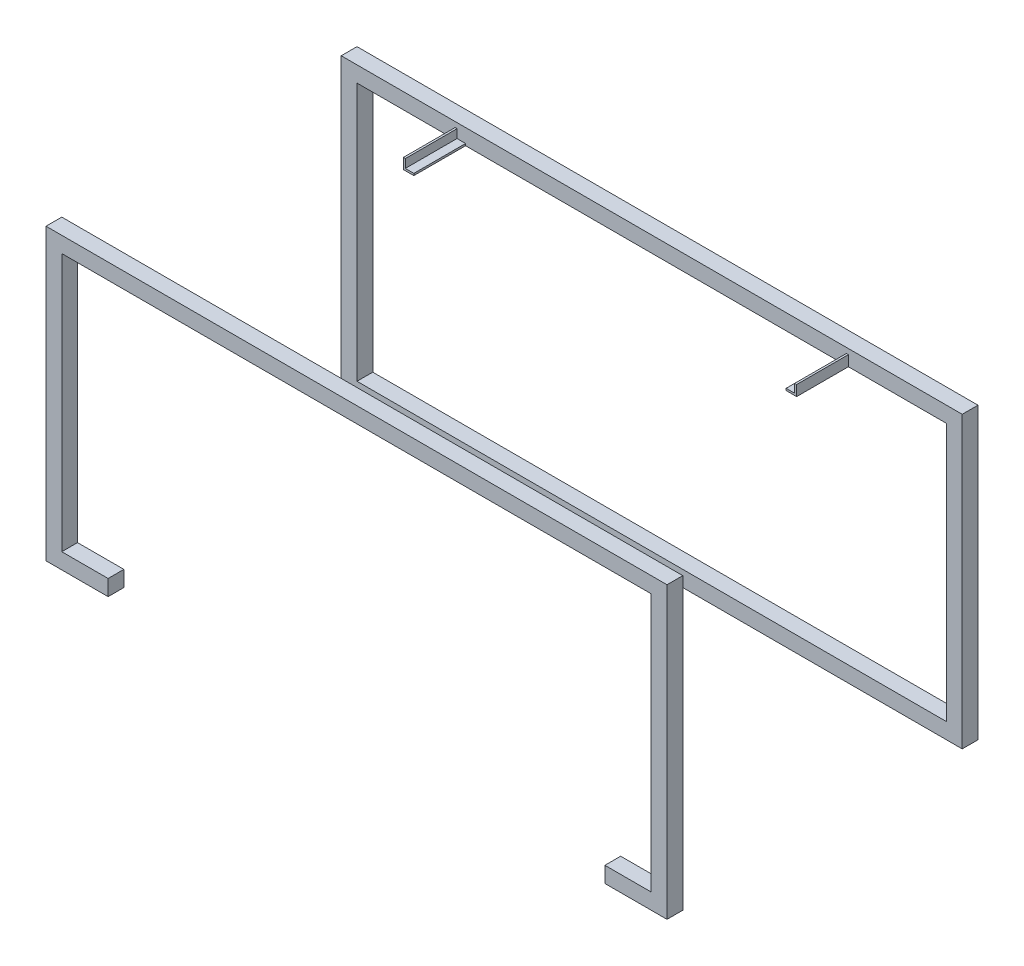
ISO-10303-21;
HEADER;
FILE_DESCRIPTION(('STEP AP214'),'2;1');
FILE_NAME('part.step','',(''),(''),'','','');
FILE_SCHEMA(('AUTOMOTIVE_DESIGN { 1 0 10303 214 1 1 1 1 }'));
ENDSEC;
DATA;
#1=APPLICATION_CONTEXT('core data for automotive mechanical design processes');
#2=APPLICATION_PROTOCOL_DEFINITION('international standard','automotive_design',2000,#1);
#3=PRODUCT_CONTEXT('',#1,'mechanical');
#4=PRODUCT('Part','Part','',(#3));
#5=PRODUCT_RELATED_PRODUCT_CATEGORY('part','',(#4));
#6=PRODUCT_DEFINITION_FORMATION('','',#4);
#7=PRODUCT_DEFINITION_CONTEXT('part definition',#1,'design');
#8=PRODUCT_DEFINITION('design','',#6,#7);
#9=PRODUCT_DEFINITION_SHAPE('','',#8);
#10=(LENGTH_UNIT() NAMED_UNIT(*) SI_UNIT(.MILLI.,.METRE.));
#11=(NAMED_UNIT(*) PLANE_ANGLE_UNIT() SI_UNIT($,.RADIAN.));
#12=(NAMED_UNIT(*) SI_UNIT($,.STERADIAN.) SOLID_ANGLE_UNIT());
#13=UNCERTAINTY_MEASURE_WITH_UNIT(LENGTH_MEASURE(1.E-05),#10,'distance_accuracy_value','');
#14=(GEOMETRIC_REPRESENTATION_CONTEXT(3) GLOBAL_UNCERTAINTY_ASSIGNED_CONTEXT((#13)) GLOBAL_UNIT_ASSIGNED_CONTEXT((#10,
#11,#12)) REPRESENTATION_CONTEXT('',''));
#15=CARTESIAN_POINT('',(0.,0.,0.));
#16=DIRECTION('',(0.,0.,1.));
#17=DIRECTION('',(1.,0.,0.));
#18=AXIS2_PLACEMENT_3D('',#15,#16,#17);
#19=CARTESIAN_POINT('',(0.,0.,76.2));
#20=DIRECTION('',(0.,1.,0.));
#21=DIRECTION('',(0.,0.,1.));
#22=AXIS2_PLACEMENT_3D('',#19,#20,#21);
#23=PLANE('',#22);
#24=DIRECTION('',(0.,0.,-1.));
#25=VECTOR('',#24,1.);
#26=CARTESIAN_POINT('',(3000.,0.,76.2));
#27=LINE('',#26,#25);
#28=CARTESIAN_POINT('',(3000.,0.,76.2));
#29=VERTEX_POINT('',#28);
#30=CARTESIAN_POINT('',(3000.,0.,0.));
#31=VERTEX_POINT('',#30);
#32=EDGE_CURVE('E213',#29,#31,#27,.T.);
#33=ORIENTED_EDGE('',*,*,#32,.F.);
#34=DIRECTION('',(-1.,0.,0.));
#35=VECTOR('',#34,1.);
#36=CARTESIAN_POINT('',(4352.14882316999,0.,76.2));
#37=LINE('',#36,#35);
#38=CARTESIAN_POINT('',(0.,0.,76.2));
#39=VERTEX_POINT('',#38);
#40=EDGE_CURVE('E210',#29,#39,#37,.T.);
#41=ORIENTED_EDGE('',*,*,#40,.T.);
#42=DIRECTION('',(0.,0.,-1.));
#43=VECTOR('',#42,1.);
#44=CARTESIAN_POINT('',(0.,0.,76.2));
#45=LINE('',#44,#43);
#46=CARTESIAN_POINT('',(0.,0.,0.));
#47=VERTEX_POINT('',#46);
#48=EDGE_CURVE('E48',#39,#47,#45,.T.);
#49=ORIENTED_EDGE('',*,*,#48,.T.);
#50=DIRECTION('',(1.,0.,0.));
#51=VECTOR('',#50,1.);
#52=CARTESIAN_POINT('',(0.,0.,0.));
#53=LINE('',#52,#51);
#54=EDGE_CURVE('E217',#47,#31,#53,.T.);
#55=ORIENTED_EDGE('',*,*,#54,.T.);
#56=EDGE_LOOP('',(#33,#41,#49,#55));
#57=FACE_BOUND('',#56,.T.);
#58=ADVANCED_FACE('F45',(#57),#23,.F.);
#59=CARTESIAN_POINT('',(3000.,1400.,76.2));
#60=DIRECTION('',(-1.,0.,0.));
#61=DIRECTION('',(0.,0.,1.));
#62=AXIS2_PLACEMENT_3D('',#59,#60,#61);
#63=PLANE('',#62);
#64=DIRECTION('',(0.,1.,0.));
#65=VECTOR('',#64,1.);
#66=CARTESIAN_POINT('',(3000.,1400.,76.2));
#67=LINE('',#66,#65);
#68=CARTESIAN_POINT('',(3000.,1400.,76.2));
#69=VERTEX_POINT('',#68);
#70=EDGE_CURVE('E229',#29,#69,#67,.T.);
#71=ORIENTED_EDGE('',*,*,#70,.F.);
#72=ORIENTED_EDGE('',*,*,#32,.T.);
#73=DIRECTION('',(0.,1.,0.));
#74=VECTOR('',#73,1.);
#75=CARTESIAN_POINT('',(3000.,1400.,0.));
#76=LINE('',#75,#74);
#77=CARTESIAN_POINT('',(3000.,1400.,0.));
#78=VERTEX_POINT('',#77);
#79=EDGE_CURVE('E216',#31,#78,#76,.T.);
#80=ORIENTED_EDGE('',*,*,#79,.T.);
#81=DIRECTION('',(0.,0.,-1.));
#82=VECTOR('',#81,1.);
#83=CARTESIAN_POINT('',(3000.,1400.,76.2));
#84=LINE('',#83,#82);
#85=EDGE_CURVE('E218',#69,#78,#84,.T.);
#86=ORIENTED_EDGE('',*,*,#85,.F.);
#87=EDGE_LOOP('',(#71,#72,#80,#86));
#88=FACE_BOUND('',#87,.T.);
#89=ADVANCED_FACE('F406',(#88),#63,.F.);
#90=CARTESIAN_POINT('',(0.,0.,76.2));
#91=DIRECTION('',(1.,0.,0.));
#92=DIRECTION('',(0.,0.,-1.));
#93=AXIS2_PLACEMENT_3D('',#90,#91,#92);
#94=PLANE('',#93);
#95=ORIENTED_EDGE('',*,*,#48,.F.);
#96=DIRECTION('',(0.,-1.,0.));
#97=VECTOR('',#96,1.);
#98=CARTESIAN_POINT('',(0.,0.,76.2));
#99=LINE('',#98,#97);
#100=CARTESIAN_POINT('',(0.,1400.,76.2000000000003));
#101=VERTEX_POINT('',#100);
#102=EDGE_CURVE('E221',#101,#39,#99,.T.);
#103=ORIENTED_EDGE('',*,*,#102,.F.);
#104=DIRECTION('',(0.,0.,-1.));
#105=VECTOR('',#104,1.);
#106=CARTESIAN_POINT('',(0.,1400.,76.2));
#107=LINE('',#106,#105);
#108=CARTESIAN_POINT('',(0.,1400.,0.));
#109=VERTEX_POINT('',#108);
#110=EDGE_CURVE('E222',#101,#109,#107,.T.);
#111=ORIENTED_EDGE('',*,*,#110,.T.);
#112=DIRECTION('',(0.,-1.,0.));
#113=VECTOR('',#112,1.);
#114=CARTESIAN_POINT('',(0.,0.,0.));
#115=LINE('',#114,#113);
#116=EDGE_CURVE('E224',#109,#47,#115,.T.);
#117=ORIENTED_EDGE('',*,*,#116,.T.);
#118=EDGE_LOOP('',(#95,#103,#111,#117));
#119=FACE_BOUND('',#118,.T.);
#120=ADVANCED_FACE('F411',(#119),#94,.F.);
#121=CARTESIAN_POINT('',(0.,0.,76.2));
#122=DIRECTION('',(0.,0.,-1.));
#123=DIRECTION('',(-1.,0.,0.));
#124=AXIS2_PLACEMENT_3D('',#121,#122,#123);
#125=PLANE('',#124);
#126=DIRECTION('',(0.,1.,0.));
#127=VECTOR('',#126,1.);
#128=CARTESIAN_POINT('',(2923.8,1323.8,76.2));
#129=LINE('',#128,#127);
#130=CARTESIAN_POINT('',(2923.8,76.2,76.2));
#131=VERTEX_POINT('',#130);
#132=CARTESIAN_POINT('',(2923.8,1323.8,76.2));
#133=VERTEX_POINT('',#132);
#134=EDGE_CURVE('E254',#131,#133,#129,.T.);
#135=ORIENTED_EDGE('',*,*,#134,.F.);
#136=DIRECTION('',(1.,0.,0.));
#137=VECTOR('',#136,1.);
#138=CARTESIAN_POINT('',(76.2,76.2,76.2));
#139=LINE('',#138,#137);
#140=CARTESIAN_POINT('',(76.2,76.2,76.2));
#141=VERTEX_POINT('',#140);
#142=EDGE_CURVE('E63',#141,#131,#139,.T.);
#143=ORIENTED_EDGE('',*,*,#142,.F.);
#144=DIRECTION('',(0.,-1.,0.));
#145=VECTOR('',#144,1.);
#146=CARTESIAN_POINT('',(76.2,76.2,76.2));
#147=LINE('',#146,#145);
#148=CARTESIAN_POINT('',(76.2,1323.8,76.2));
#149=VERTEX_POINT('',#148);
#150=EDGE_CURVE('E251',#149,#141,#147,.T.);
#151=ORIENTED_EDGE('',*,*,#150,.F.);
#152=DIRECTION('',(-1.,0.,0.));
#153=VECTOR('',#152,1.);
#154=CARTESIAN_POINT('',(76.2,1323.8,76.2));
#155=LINE('',#154,#153);
#156=CARTESIAN_POINT('',(550.,1323.8,76.2));
#157=VERTEX_POINT('',#156);
#158=EDGE_CURVE('E262',#157,#149,#155,.T.);
#159=ORIENTED_EDGE('',*,*,#158,.F.);
#160=DIRECTION('',(0.,-1.,0.));
#161=VECTOR('',#160,1.);
#162=CARTESIAN_POINT('',(550.,1323.8,76.2));
#163=LINE('',#162,#161);
#164=CARTESIAN_POINT('',(550.,1374.6,76.2));
#165=VERTEX_POINT('',#164);
#166=EDGE_CURVE('E296',#165,#157,#163,.T.);
#167=ORIENTED_EDGE('',*,*,#166,.F.);
#168=DIRECTION('',(-1.,0.,0.));
#169=VECTOR('',#168,1.);
#170=CARTESIAN_POINT('',(559.525,1374.6,76.2));
#171=LINE('',#170,#169);
#172=CARTESIAN_POINT('',(559.525,1374.6,76.2));
#173=VERTEX_POINT('',#172);
#174=EDGE_CURVE('E292',#173,#165,#171,.T.);
#175=ORIENTED_EDGE('',*,*,#174,.F.);
#176=DIRECTION('',(0.,1.,0.));
#177=VECTOR('',#176,1.);
#178=CARTESIAN_POINT('',(559.525,1333.325,76.2));
#179=LINE('',#178,#177);
#180=CARTESIAN_POINT('',(559.525,1333.325,76.2));
#181=VERTEX_POINT('',#180);
#182=EDGE_CURVE('E288',#181,#173,#179,.T.);
#183=ORIENTED_EDGE('',*,*,#182,.F.);
#184=DIRECTION('',(-1.,0.,0.));
#185=VECTOR('',#184,1.);
#186=CARTESIAN_POINT('',(559.525,1333.325,76.2));
#187=LINE('',#186,#185);
#188=CARTESIAN_POINT('',(600.8,1333.325,76.2));
#189=VERTEX_POINT('',#188);
#190=EDGE_CURVE('E284',#189,#181,#187,.T.);
#191=ORIENTED_EDGE('',*,*,#190,.F.);
#192=DIRECTION('',(0.,1.,0.));
#193=VECTOR('',#192,1.);
#194=CARTESIAN_POINT('',(600.8,1333.325,76.2));
#195=LINE('',#194,#193);
#196=CARTESIAN_POINT('',(600.8,1323.8,76.2));
#197=VERTEX_POINT('',#196);
#198=EDGE_CURVE('E261',#197,#189,#195,.T.);
#199=ORIENTED_EDGE('',*,*,#198,.F.);
#200=CARTESIAN_POINT('',(2399.2,1323.8,76.2));
#201=VERTEX_POINT('',#200);
#202=EDGE_CURVE('E198',#201,#197,#155,.T.);
#203=ORIENTED_EDGE('',*,*,#202,.F.);
#204=DIRECTION('',(0.,-1.,0.));
#205=VECTOR('',#204,1.);
#206=CARTESIAN_POINT('',(2399.2,1333.325,76.2));
#207=LINE('',#206,#205);
#208=CARTESIAN_POINT('',(2399.2,1333.325,76.2));
#209=VERTEX_POINT('',#208);
#210=EDGE_CURVE('E192',#209,#201,#207,.T.);
#211=ORIENTED_EDGE('',*,*,#210,.F.);
#212=DIRECTION('',(-1.,0.,0.));
#213=VECTOR('',#212,1.);
#214=CARTESIAN_POINT('',(2440.475,1333.325,76.2));
#215=LINE('',#214,#213);
#216=CARTESIAN_POINT('',(2440.475,1333.325,76.2));
#217=VERTEX_POINT('',#216);
#218=EDGE_CURVE('E188',#217,#209,#215,.T.);
#219=ORIENTED_EDGE('',*,*,#218,.F.);
#220=DIRECTION('',(0.,-1.,0.));
#221=VECTOR('',#220,1.);
#222=CARTESIAN_POINT('',(2440.475,1333.325,76.2));
#223=LINE('',#222,#221);
#224=CARTESIAN_POINT('',(2440.475,1374.6,76.2));
#225=VERTEX_POINT('',#224);
#226=EDGE_CURVE('E177',#225,#217,#223,.T.);
#227=ORIENTED_EDGE('',*,*,#226,.F.);
#228=DIRECTION('',(-1.,0.,0.));
#229=VECTOR('',#228,1.);
#230=CARTESIAN_POINT('',(2440.475,1374.6,76.2));
#231=LINE('',#230,#229);
#232=CARTESIAN_POINT('',(2450.,1374.6,76.2));
#233=VERTEX_POINT('',#232);
#234=EDGE_CURVE('E178',#233,#225,#231,.T.);
#235=ORIENTED_EDGE('',*,*,#234,.F.);
#236=DIRECTION('',(0.,1.,0.));
#237=VECTOR('',#236,1.);
#238=CARTESIAN_POINT('',(2450.,1323.8,76.2));
#239=LINE('',#238,#237);
#240=CARTESIAN_POINT('',(2450.,1323.8,76.2));
#241=VERTEX_POINT('',#240);
#242=EDGE_CURVE('E175',#241,#233,#239,.T.);
#243=ORIENTED_EDGE('',*,*,#242,.F.);
#244=EDGE_CURVE('E199',#133,#241,#155,.T.);
#245=ORIENTED_EDGE('',*,*,#244,.F.);
#246=EDGE_LOOP('',(#135,#143,#151,#159,#167,#175,#183,#191,#199,#203,#211,#219,#227,#235,#243,#245));
#247=FACE_BOUND('',#246,.T.);
#248=ORIENTED_EDGE('',*,*,#40,.F.);
#249=ORIENTED_EDGE('',*,*,#70,.T.);
#250=DIRECTION('',(-1.,0.,0.));
#251=VECTOR('',#250,1.);
#252=CARTESIAN_POINT('',(0.,1400.,76.2));
#253=LINE('',#252,#251);
#254=EDGE_CURVE('E243',#69,#101,#253,.T.);
#255=ORIENTED_EDGE('',*,*,#254,.T.);
#256=ORIENTED_EDGE('',*,*,#102,.T.);
#257=EDGE_LOOP('',(#248,#249,#255,#256));
#258=FACE_BOUND('',#257,.T.);
#259=ADVANCED_FACE('F334',(#247,#258),#125,.F.);
#260=CARTESIAN_POINT('',(0.,1400.,76.2));
#261=DIRECTION('',(0.,-1.,0.));
#262=DIRECTION('',(0.,0.,-1.));
#263=AXIS2_PLACEMENT_3D('',#260,#261,#262);
#264=PLANE('',#263);
#265=ORIENTED_EDGE('',*,*,#110,.F.);
#266=ORIENTED_EDGE('',*,*,#254,.F.);
#267=ORIENTED_EDGE('',*,*,#85,.T.);
#268=DIRECTION('',(-1.,0.,0.));
#269=VECTOR('',#268,1.);
#270=CARTESIAN_POINT('',(0.,1400.,0.));
#271=LINE('',#270,#269);
#272=EDGE_CURVE('E220',#78,#109,#271,.T.);
#273=ORIENTED_EDGE('',*,*,#272,.T.);
#274=EDGE_LOOP('',(#265,#266,#267,#273));
#275=FACE_BOUND('',#274,.T.);
#276=ADVANCED_FACE('F418',(#275),#264,.F.);
#277=CARTESIAN_POINT('',(0.,0.,0.));
#278=DIRECTION('',(0.,0.,-1.));
#279=DIRECTION('',(-1.,0.,0.));
#280=AXIS2_PLACEMENT_3D('',#277,#278,#279);
#281=PLANE('',#280);
#282=ORIENTED_EDGE('',*,*,#54,.F.);
#283=ORIENTED_EDGE('',*,*,#116,.F.);
#284=ORIENTED_EDGE('',*,*,#272,.F.);
#285=ORIENTED_EDGE('',*,*,#79,.F.);
#286=EDGE_LOOP('',(#282,#283,#284,#285));
#287=FACE_BOUND('',#286,.T.);
#288=DIRECTION('',(-1.,0.,0.));
#289=VECTOR('',#288,1.);
#290=CARTESIAN_POINT('',(76.2,1323.8,0.));
#291=LINE('',#290,#289);
#292=CARTESIAN_POINT('',(2923.8,1323.8,0.));
#293=VERTEX_POINT('',#292);
#294=CARTESIAN_POINT('',(76.2,1323.8,0.));
#295=VERTEX_POINT('',#294);
#296=EDGE_CURVE('E263',#293,#295,#291,.T.);
#297=ORIENTED_EDGE('',*,*,#296,.T.);
#298=DIRECTION('',(0.,-1.,0.));
#299=VECTOR('',#298,1.);
#300=CARTESIAN_POINT('',(76.2,76.2,0.));
#301=LINE('',#300,#299);
#302=CARTESIAN_POINT('',(76.2,76.2,0.));
#303=VERTEX_POINT('',#302);
#304=EDGE_CURVE('E266',#295,#303,#301,.T.);
#305=ORIENTED_EDGE('',*,*,#304,.T.);
#306=DIRECTION('',(1.,0.,0.));
#307=VECTOR('',#306,1.);
#308=CARTESIAN_POINT('',(76.2,76.2,0.));
#309=LINE('',#308,#307);
#310=CARTESIAN_POINT('',(2923.8,76.2,0.));
#311=VERTEX_POINT('',#310);
#312=EDGE_CURVE('E270',#303,#311,#309,.T.);
#313=ORIENTED_EDGE('',*,*,#312,.T.);
#314=DIRECTION('',(0.,1.,0.));
#315=VECTOR('',#314,1.);
#316=CARTESIAN_POINT('',(2923.8,1323.8,0.));
#317=LINE('',#316,#315);
#318=EDGE_CURVE('E267',#311,#293,#317,.T.);
#319=ORIENTED_EDGE('',*,*,#318,.T.);
#320=EDGE_LOOP('',(#297,#305,#313,#319));
#321=FACE_BOUND('',#320,.T.);
#322=ADVANCED_FACE('F380',(#287,#321),#281,.T.);
#323=CARTESIAN_POINT('',(76.2,76.2,76.2));
#324=DIRECTION('',(1.,0.,0.));
#325=DIRECTION('',(0.,0.,-1.));
#326=AXIS2_PLACEMENT_3D('',#323,#324,#325);
#327=PLANE('',#326);
#328=ORIENTED_EDGE('',*,*,#304,.F.);
#329=DIRECTION('',(0.,0.,-1.));
#330=VECTOR('',#329,1.);
#331=CARTESIAN_POINT('',(76.2,1323.8,76.2));
#332=LINE('',#331,#330);
#333=EDGE_CURVE('E258',#149,#295,#332,.T.);
#334=ORIENTED_EDGE('',*,*,#333,.F.);
#335=ORIENTED_EDGE('',*,*,#150,.T.);
#336=DIRECTION('',(0.,0.,-1.));
#337=VECTOR('',#336,1.);
#338=CARTESIAN_POINT('',(76.2,76.2,76.2));
#339=LINE('',#338,#337);
#340=EDGE_CURVE('E248',#141,#303,#339,.T.);
#341=ORIENTED_EDGE('',*,*,#340,.T.);
#342=EDGE_LOOP('',(#328,#334,#335,#341));
#343=FACE_BOUND('',#342,.T.);
#344=ADVANCED_FACE('F378',(#343),#327,.T.);
#345=CARTESIAN_POINT('',(76.2,76.2,76.2));
#346=DIRECTION('',(0.,1.,0.));
#347=DIRECTION('',(0.,0.,1.));
#348=AXIS2_PLACEMENT_3D('',#345,#346,#347);
#349=PLANE('',#348);
#350=ORIENTED_EDGE('',*,*,#312,.F.);
#351=ORIENTED_EDGE('',*,*,#340,.F.);
#352=ORIENTED_EDGE('',*,*,#142,.T.);
#353=DIRECTION('',(0.,0.,-1.));
#354=VECTOR('',#353,1.);
#355=CARTESIAN_POINT('',(2923.8,76.2,76.2));
#356=LINE('',#355,#354);
#357=EDGE_CURVE('E252',#131,#311,#356,.T.);
#358=ORIENTED_EDGE('',*,*,#357,.T.);
#359=EDGE_LOOP('',(#350,#351,#352,#358));
#360=FACE_BOUND('',#359,.T.);
#361=ADVANCED_FACE('F375',(#360),#349,.T.);
#362=CARTESIAN_POINT('',(2923.8,1323.8,76.2));
#363=DIRECTION('',(-1.,0.,0.));
#364=DIRECTION('',(0.,0.,1.));
#365=AXIS2_PLACEMENT_3D('',#362,#363,#364);
#366=PLANE('',#365);
#367=ORIENTED_EDGE('',*,*,#318,.F.);
#368=ORIENTED_EDGE('',*,*,#357,.F.);
#369=ORIENTED_EDGE('',*,*,#134,.T.);
#370=DIRECTION('',(0.,0.,-1.));
#371=VECTOR('',#370,1.);
#372=CARTESIAN_POINT('',(2923.8,1323.8,76.2));
#373=LINE('',#372,#371);
#374=EDGE_CURVE('E255',#133,#293,#373,.T.);
#375=ORIENTED_EDGE('',*,*,#374,.T.);
#376=EDGE_LOOP('',(#367,#368,#369,#375));
#377=FACE_BOUND('',#376,.T.);
#378=ADVANCED_FACE('F383',(#377),#366,.T.);
#379=CARTESIAN_POINT('',(76.2,1323.8,76.2));
#380=DIRECTION('',(0.,-1.,0.));
#381=DIRECTION('',(0.,0.,-1.));
#382=AXIS2_PLACEMENT_3D('',#379,#380,#381);
#383=PLANE('',#382);
#384=ORIENTED_EDGE('',*,*,#296,.F.);
#385=ORIENTED_EDGE('',*,*,#374,.F.);
#386=ORIENTED_EDGE('',*,*,#244,.T.);
#387=DIRECTION('',(0.,0.,-1.));
#388=VECTOR('',#387,1.);
#389=CARTESIAN_POINT('',(2450.,1323.8,326.2));
#390=LINE('',#389,#388);
#391=CARTESIAN_POINT('',(2450.,1323.8,326.2));
#392=VERTEX_POINT('',#391);
#393=EDGE_CURVE('E181',#392,#241,#390,.T.);
#394=ORIENTED_EDGE('',*,*,#393,.F.);
#395=DIRECTION('',(1.,0.,0.));
#396=VECTOR('',#395,1.);
#397=CARTESIAN_POINT('',(2450.,1323.8,326.2));
#398=LINE('',#397,#396);
#399=CARTESIAN_POINT('',(2399.2,1323.8,326.2));
#400=VERTEX_POINT('',#399);
#401=EDGE_CURVE('E12',#400,#392,#398,.T.);
#402=ORIENTED_EDGE('',*,*,#401,.F.);
#403=DIRECTION('',(0.,0.,-1.));
#404=VECTOR('',#403,1.);
#405=CARTESIAN_POINT('',(2399.2,1323.8,326.2));
#406=LINE('',#405,#404);
#407=EDGE_CURVE('E195',#400,#201,#406,.T.);
#408=ORIENTED_EDGE('',*,*,#407,.T.);
#409=ORIENTED_EDGE('',*,*,#202,.T.);
#410=DIRECTION('',(0.,0.,-1.));
#411=VECTOR('',#410,1.);
#412=CARTESIAN_POINT('',(600.8,1323.8,326.2));
#413=LINE('',#412,#411);
#414=CARTESIAN_POINT('',(600.8,1323.8,326.2));
#415=VERTEX_POINT('',#414);
#416=EDGE_CURVE('E281',#415,#197,#413,.T.);
#417=ORIENTED_EDGE('',*,*,#416,.F.);
#418=DIRECTION('',(1.,0.,0.));
#419=VECTOR('',#418,1.);
#420=CARTESIAN_POINT('',(550.,1323.8,326.2));
#421=LINE('',#420,#419);
#422=CARTESIAN_POINT('',(550.,1323.8,326.2));
#423=VERTEX_POINT('',#422);
#424=EDGE_CURVE('E185',#423,#415,#421,.T.);
#425=ORIENTED_EDGE('',*,*,#424,.F.);
#426=DIRECTION('',(0.,0.,-1.));
#427=VECTOR('',#426,1.);
#428=CARTESIAN_POINT('',(550.,1323.8,326.2));
#429=LINE('',#428,#427);
#430=EDGE_CURVE('E300',#423,#157,#429,.T.);
#431=ORIENTED_EDGE('',*,*,#430,.T.);
#432=ORIENTED_EDGE('',*,*,#158,.T.);
#433=ORIENTED_EDGE('',*,*,#333,.T.);
#434=EDGE_LOOP('',(#384,#385,#386,#394,#402,#408,#409,#417,#425,#431,#432,#433));
#435=FACE_BOUND('',#434,.T.);
#436=ADVANCED_FACE('F326',(#435),#383,.T.);
#437=CARTESIAN_POINT('',(600.8,1333.325,326.2));
#438=DIRECTION('',(-1.,0.,0.));
#439=DIRECTION('',(0.,0.,1.));
#440=AXIS2_PLACEMENT_3D('',#437,#438,#439);
#441=PLANE('',#440);
#442=ORIENTED_EDGE('',*,*,#198,.T.);
#443=DIRECTION('',(0.,0.,-1.));
#444=VECTOR('',#443,1.);
#445=CARTESIAN_POINT('',(600.8,1333.325,326.2));
#446=LINE('',#445,#444);
#447=CARTESIAN_POINT('',(600.8,1333.325,326.2));
#448=VERTEX_POINT('',#447);
#449=EDGE_CURVE('E285',#448,#189,#446,.T.);
#450=ORIENTED_EDGE('',*,*,#449,.F.);
#451=DIRECTION('',(0.,1.,0.));
#452=VECTOR('',#451,1.);
#453=CARTESIAN_POINT('',(600.8,1333.325,326.2));
#454=LINE('',#453,#452);
#455=EDGE_CURVE('E315',#415,#448,#454,.T.);
#456=ORIENTED_EDGE('',*,*,#455,.F.);
#457=ORIENTED_EDGE('',*,*,#416,.T.);
#458=EDGE_LOOP('',(#442,#450,#456,#457));
#459=FACE_BOUND('',#458,.T.);
#460=ADVANCED_FACE('F330',(#459),#441,.F.);
#461=CARTESIAN_POINT('',(559.525,1333.325,326.2));
#462=DIRECTION('',(0.,-1.,0.));
#463=DIRECTION('',(0.,0.,-1.));
#464=AXIS2_PLACEMENT_3D('',#461,#462,#463);
#465=PLANE('',#464);
#466=ORIENTED_EDGE('',*,*,#190,.T.);
#467=DIRECTION('',(0.,0.,-1.));
#468=VECTOR('',#467,1.);
#469=CARTESIAN_POINT('',(559.525,1333.325,326.2));
#470=LINE('',#469,#468);
#471=CARTESIAN_POINT('',(559.525,1333.325,326.2));
#472=VERTEX_POINT('',#471);
#473=EDGE_CURVE('E289',#472,#181,#470,.T.);
#474=ORIENTED_EDGE('',*,*,#473,.F.);
#475=DIRECTION('',(-1.,0.,0.));
#476=VECTOR('',#475,1.);
#477=CARTESIAN_POINT('',(559.525,1333.325,326.2));
#478=LINE('',#477,#476);
#479=EDGE_CURVE('E314',#448,#472,#478,.T.);
#480=ORIENTED_EDGE('',*,*,#479,.F.);
#481=ORIENTED_EDGE('',*,*,#449,.T.);
#482=EDGE_LOOP('',(#466,#474,#480,#481));
#483=FACE_BOUND('',#482,.T.);
#484=ADVANCED_FACE('F341',(#483),#465,.F.);
#485=CARTESIAN_POINT('',(559.525,1333.325,326.2));
#486=DIRECTION('',(-1.,0.,0.));
#487=DIRECTION('',(0.,0.,1.));
#488=AXIS2_PLACEMENT_3D('',#485,#486,#487);
#489=PLANE('',#488);
#490=ORIENTED_EDGE('',*,*,#182,.T.);
#491=DIRECTION('',(0.,0.,-1.));
#492=VECTOR('',#491,1.);
#493=CARTESIAN_POINT('',(559.525,1374.6,326.2));
#494=LINE('',#493,#492);
#495=CARTESIAN_POINT('',(559.525,1374.6,326.2));
#496=VERTEX_POINT('',#495);
#497=EDGE_CURVE('E293',#496,#173,#494,.T.);
#498=ORIENTED_EDGE('',*,*,#497,.F.);
#499=DIRECTION('',(0.,1.,0.));
#500=VECTOR('',#499,1.);
#501=CARTESIAN_POINT('',(559.525,1333.325,326.2));
#502=LINE('',#501,#500);
#503=EDGE_CURVE('E312',#472,#496,#502,.T.);
#504=ORIENTED_EDGE('',*,*,#503,.F.);
#505=ORIENTED_EDGE('',*,*,#473,.T.);
#506=EDGE_LOOP('',(#490,#498,#504,#505));
#507=FACE_BOUND('',#506,.T.);
#508=ADVANCED_FACE('F345',(#507),#489,.F.);
#509=CARTESIAN_POINT('',(559.525,1374.6,326.2));
#510=DIRECTION('',(0.,-1.,0.));
#511=DIRECTION('',(0.,0.,-1.));
#512=AXIS2_PLACEMENT_3D('',#509,#510,#511);
#513=PLANE('',#512);
#514=ORIENTED_EDGE('',*,*,#174,.T.);
#515=DIRECTION('',(0.,0.,-1.));
#516=VECTOR('',#515,1.);
#517=CARTESIAN_POINT('',(550.,1374.6,326.2));
#518=LINE('',#517,#516);
#519=CARTESIAN_POINT('',(550.,1374.6,326.2));
#520=VERTEX_POINT('',#519);
#521=EDGE_CURVE('E297',#520,#165,#518,.T.);
#522=ORIENTED_EDGE('',*,*,#521,.F.);
#523=DIRECTION('',(-1.,0.,0.));
#524=VECTOR('',#523,1.);
#525=CARTESIAN_POINT('',(559.525,1374.6,326.2));
#526=LINE('',#525,#524);
#527=EDGE_CURVE('E310',#496,#520,#526,.T.);
#528=ORIENTED_EDGE('',*,*,#527,.F.);
#529=ORIENTED_EDGE('',*,*,#497,.T.);
#530=EDGE_LOOP('',(#514,#522,#528,#529));
#531=FACE_BOUND('',#530,.T.);
#532=ADVANCED_FACE('F350',(#531),#513,.F.);
#533=CARTESIAN_POINT('',(550.,1323.8,326.2));
#534=DIRECTION('',(1.,0.,0.));
#535=DIRECTION('',(0.,0.,-1.));
#536=AXIS2_PLACEMENT_3D('',#533,#534,#535);
#537=PLANE('',#536);
#538=ORIENTED_EDGE('',*,*,#166,.T.);
#539=ORIENTED_EDGE('',*,*,#430,.F.);
#540=DIRECTION('',(0.,-1.,0.));
#541=VECTOR('',#540,1.);
#542=CARTESIAN_POINT('',(550.,1323.8,326.2));
#543=LINE('',#542,#541);
#544=EDGE_CURVE('E204',#520,#423,#543,.T.);
#545=ORIENTED_EDGE('',*,*,#544,.F.);
#546=ORIENTED_EDGE('',*,*,#521,.T.);
#547=EDGE_LOOP('',(#538,#539,#545,#546));
#548=FACE_BOUND('',#547,.T.);
#549=ADVANCED_FACE('F353',(#548),#537,.F.);
#550=CARTESIAN_POINT('',(0.,0.,326.2));
#551=DIRECTION('',(0.,0.,-1.));
#552=DIRECTION('',(-1.,0.,0.));
#553=AXIS2_PLACEMENT_3D('',#550,#551,#552);
#554=PLANE('',#553);
#555=ORIENTED_EDGE('',*,*,#424,.T.);
#556=ORIENTED_EDGE('',*,*,#455,.T.);
#557=ORIENTED_EDGE('',*,*,#479,.T.);
#558=ORIENTED_EDGE('',*,*,#503,.T.);
#559=ORIENTED_EDGE('',*,*,#527,.T.);
#560=ORIENTED_EDGE('',*,*,#544,.T.);
#561=EDGE_LOOP('',(#555,#556,#557,#558,#559,#560));
#562=FACE_BOUND('',#561,.T.);
#563=ADVANCED_FACE('F321',(#562),#554,.F.);
#564=CARTESIAN_POINT('',(2450.,1323.8,326.2));
#565=DIRECTION('',(-1.,0.,0.));
#566=DIRECTION('',(0.,0.,1.));
#567=AXIS2_PLACEMENT_3D('',#564,#565,#566);
#568=PLANE('',#567);
#569=ORIENTED_EDGE('',*,*,#242,.T.);
#570=DIRECTION('',(0.,0.,-1.));
#571=VECTOR('',#570,1.);
#572=CARTESIAN_POINT('',(2450.,1374.6,326.2));
#573=LINE('',#572,#571);
#574=CARTESIAN_POINT('',(2450.,1374.6,326.2));
#575=VERTEX_POINT('',#574);
#576=EDGE_CURVE('E157',#575,#233,#573,.T.);
#577=ORIENTED_EDGE('',*,*,#576,.F.);
#578=DIRECTION('',(0.,1.,0.));
#579=VECTOR('',#578,1.);
#580=CARTESIAN_POINT('',(2450.,1323.8,326.2));
#581=LINE('',#580,#579);
#582=EDGE_CURVE('E164',#392,#575,#581,.T.);
#583=ORIENTED_EDGE('',*,*,#582,.F.);
#584=ORIENTED_EDGE('',*,*,#393,.T.);
#585=EDGE_LOOP('',(#569,#577,#583,#584));
#586=FACE_BOUND('',#585,.T.);
#587=ADVANCED_FACE('F173',(#586),#568,.F.);
#588=CARTESIAN_POINT('',(2440.475,1374.6,326.2));
#589=DIRECTION('',(0.,-1.,0.));
#590=DIRECTION('',(0.,0.,-1.));
#591=AXIS2_PLACEMENT_3D('',#588,#589,#590);
#592=PLANE('',#591);
#593=ORIENTED_EDGE('',*,*,#234,.T.);
#594=DIRECTION('',(0.,0.,-1.));
#595=VECTOR('',#594,1.);
#596=CARTESIAN_POINT('',(2440.475,1374.6,326.2));
#597=LINE('',#596,#595);
#598=CARTESIAN_POINT('',(2440.475,1374.6,326.2));
#599=VERTEX_POINT('',#598);
#600=EDGE_CURVE('E160',#599,#225,#597,.T.);
#601=ORIENTED_EDGE('',*,*,#600,.F.);
#602=DIRECTION('',(-1.,0.,0.));
#603=VECTOR('',#602,1.);
#604=CARTESIAN_POINT('',(2440.475,1374.6,326.2));
#605=LINE('',#604,#603);
#606=EDGE_CURVE('E153',#575,#599,#605,.T.);
#607=ORIENTED_EDGE('',*,*,#606,.F.);
#608=ORIENTED_EDGE('',*,*,#576,.T.);
#609=EDGE_LOOP('',(#593,#601,#607,#608));
#610=FACE_BOUND('',#609,.T.);
#611=ADVANCED_FACE('F155',(#610),#592,.F.);
#612=CARTESIAN_POINT('',(2440.475,1333.325,326.2));
#613=DIRECTION('',(1.,0.,0.));
#614=DIRECTION('',(0.,0.,-1.));
#615=AXIS2_PLACEMENT_3D('',#612,#613,#614);
#616=PLANE('',#615);
#617=ORIENTED_EDGE('',*,*,#226,.T.);
#618=DIRECTION('',(0.,0.,-1.));
#619=VECTOR('',#618,1.);
#620=CARTESIAN_POINT('',(2440.475,1333.325,326.2));
#621=LINE('',#620,#619);
#622=CARTESIAN_POINT('',(2440.475,1333.325,326.2));
#623=VERTEX_POINT('',#622);
#624=EDGE_CURVE('E189',#623,#217,#621,.T.);
#625=ORIENTED_EDGE('',*,*,#624,.F.);
#626=DIRECTION('',(0.,-1.,0.));
#627=VECTOR('',#626,1.);
#628=CARTESIAN_POINT('',(2440.475,1333.325,326.2));
#629=LINE('',#628,#627);
#630=EDGE_CURVE('E163',#599,#623,#629,.T.);
#631=ORIENTED_EDGE('',*,*,#630,.F.);
#632=ORIENTED_EDGE('',*,*,#600,.T.);
#633=EDGE_LOOP('',(#617,#625,#631,#632));
#634=FACE_BOUND('',#633,.T.);
#635=ADVANCED_FACE('F387',(#634),#616,.F.);
#636=CARTESIAN_POINT('',(2440.475,1333.325,326.2));
#637=DIRECTION('',(0.,-1.,0.));
#638=DIRECTION('',(0.,0.,-1.));
#639=AXIS2_PLACEMENT_3D('',#636,#637,#638);
#640=PLANE('',#639);
#641=ORIENTED_EDGE('',*,*,#218,.T.);
#642=DIRECTION('',(0.,0.,-1.));
#643=VECTOR('',#642,1.);
#644=CARTESIAN_POINT('',(2399.2,1333.325,326.2));
#645=LINE('',#644,#643);
#646=CARTESIAN_POINT('',(2399.2,1333.325,326.2));
#647=VERTEX_POINT('',#646);
#648=EDGE_CURVE('E171',#647,#209,#645,.T.);
#649=ORIENTED_EDGE('',*,*,#648,.F.);
#650=DIRECTION('',(-1.,0.,0.));
#651=VECTOR('',#650,1.);
#652=CARTESIAN_POINT('',(2440.475,1333.325,326.2));
#653=LINE('',#652,#651);
#654=EDGE_CURVE('E207',#623,#647,#653,.T.);
#655=ORIENTED_EDGE('',*,*,#654,.F.);
#656=ORIENTED_EDGE('',*,*,#624,.T.);
#657=EDGE_LOOP('',(#641,#649,#655,#656));
#658=FACE_BOUND('',#657,.T.);
#659=ADVANCED_FACE('F394',(#658),#640,.F.);
#660=CARTESIAN_POINT('',(2399.2,1333.325,326.2));
#661=DIRECTION('',(1.,0.,0.));
#662=DIRECTION('',(0.,0.,-1.));
#663=AXIS2_PLACEMENT_3D('',#660,#661,#662);
#664=PLANE('',#663);
#665=ORIENTED_EDGE('',*,*,#210,.T.);
#666=ORIENTED_EDGE('',*,*,#407,.F.);
#667=DIRECTION('',(0.,-1.,0.));
#668=VECTOR('',#667,1.);
#669=CARTESIAN_POINT('',(2399.2,1333.325,326.2));
#670=LINE('',#669,#668);
#671=EDGE_CURVE('E54',#647,#400,#670,.T.);
#672=ORIENTED_EDGE('',*,*,#671,.F.);
#673=ORIENTED_EDGE('',*,*,#648,.T.);
#674=EDGE_LOOP('',(#665,#666,#672,#673));
#675=FACE_BOUND('',#674,.T.);
#676=ADVANCED_FACE('F396',(#675),#664,.F.);
#677=CARTESIAN_POINT('',(0.,0.,326.2));
#678=DIRECTION('',(0.,0.,-1.));
#679=DIRECTION('',(-1.,0.,0.));
#680=AXIS2_PLACEMENT_3D('',#677,#678,#679);
#681=PLANE('',#680);
#682=ORIENTED_EDGE('',*,*,#582,.T.);
#683=ORIENTED_EDGE('',*,*,#606,.T.);
#684=ORIENTED_EDGE('',*,*,#630,.T.);
#685=ORIENTED_EDGE('',*,*,#654,.T.);
#686=ORIENTED_EDGE('',*,*,#671,.T.);
#687=ORIENTED_EDGE('',*,*,#401,.T.);
#688=EDGE_LOOP('',(#682,#683,#684,#685,#686,#687));
#689=FACE_BOUND('',#688,.T.);
#690=ADVANCED_FACE('F167',(#689),#681,.F.);
#691=CLOSED_SHELL('',(#58,#89,#120,#259,#276,#322,#344,#361,#378,#436,#460,#484,#508,#532,#549,
#563,#587,#611,#635,#659,#676,#690));
#692=MANIFOLD_SOLID_BREP('B2',#691);
#693=CARTESIAN_POINT('',(0.,0.,1502.4));
#694=DIRECTION('',(0.,0.,1.));
#695=DIRECTION('',(1.,0.,0.));
#696=AXIS2_PLACEMENT_3D('',#693,#694,#695);
#697=PLANE('',#696);
#698=DIRECTION('',(0.,-1.,0.));
#699=VECTOR('',#698,1.);
#700=CARTESIAN_POINT('',(2700.,80.,1502.4));
#701=LINE('',#700,#699);
#702=CARTESIAN_POINT('',(2700.,76.2,1502.4));
#703=VERTEX_POINT('',#702);
#704=CARTESIAN_POINT('',(2700.,0.,1502.4));
#705=VERTEX_POINT('',#704);
#706=EDGE_CURVE('E650',#703,#705,#701,.T.);
#707=ORIENTED_EDGE('',*,*,#706,.T.);
#708=DIRECTION('',(1.,0.,0.));
#709=VECTOR('',#708,1.);
#710=CARTESIAN_POINT('',(0.,0.,1502.4));
#711=LINE('',#710,#709);
#712=CARTESIAN_POINT('',(3000.,0.,1502.4));
#713=VERTEX_POINT('',#712);
#714=EDGE_CURVE('E771',#705,#713,#711,.T.);
#715=ORIENTED_EDGE('',*,*,#714,.T.);
#716=DIRECTION('',(0.,1.,0.));
#717=VECTOR('',#716,1.);
#718=CARTESIAN_POINT('',(3000.,1400.,1502.4));
#719=LINE('',#718,#717);
#720=CARTESIAN_POINT('',(3000.,1400.,1502.4));
#721=VERTEX_POINT('',#720);
#722=EDGE_CURVE('E753',#713,#721,#719,.T.);
#723=ORIENTED_EDGE('',*,*,#722,.T.);
#724=DIRECTION('',(-1.,0.,0.));
#725=VECTOR('',#724,1.);
#726=CARTESIAN_POINT('',(0.,1400.,1502.4));
#727=LINE('',#726,#725);
#728=CARTESIAN_POINT('',(0.,1400.,1502.4));
#729=VERTEX_POINT('',#728);
#730=EDGE_CURVE('E748',#721,#729,#727,.T.);
#731=ORIENTED_EDGE('',*,*,#730,.T.);
#732=DIRECTION('',(0.,-1.,0.));
#733=VECTOR('',#732,1.);
#734=CARTESIAN_POINT('',(0.,1400.,1502.4));
#735=LINE('',#734,#733);
#736=CARTESIAN_POINT('',(0.,0.,1502.4));
#737=VERTEX_POINT('',#736);
#738=EDGE_CURVE('E775',#729,#737,#735,.T.);
#739=ORIENTED_EDGE('',*,*,#738,.T.);
#740=CARTESIAN_POINT('',(300.,0.,1502.4));
#741=VERTEX_POINT('',#740);
#742=EDGE_CURVE('E746',#737,#741,#711,.T.);
#743=ORIENTED_EDGE('',*,*,#742,.T.);
#744=DIRECTION('',(0.,-1.,0.));
#745=VECTOR('',#744,1.);
#746=CARTESIAN_POINT('',(300.,0.,1502.4));
#747=LINE('',#746,#745);
#748=CARTESIAN_POINT('',(300.,76.2,1502.4));
#749=VERTEX_POINT('',#748);
#750=EDGE_CURVE('E921',#749,#741,#747,.T.);
#751=ORIENTED_EDGE('',*,*,#750,.F.);
#752=DIRECTION('',(1.,0.,0.));
#753=VECTOR('',#752,1.);
#754=CARTESIAN_POINT('',(76.2,76.2,1502.4));
#755=LINE('',#754,#753);
#756=CARTESIAN_POINT('',(76.2,76.2,1502.4));
#757=VERTEX_POINT('',#756);
#758=EDGE_CURVE('E937',#757,#749,#755,.T.);
#759=ORIENTED_EDGE('',*,*,#758,.F.);
#760=DIRECTION('',(0.,-1.,0.));
#761=VECTOR('',#760,1.);
#762=CARTESIAN_POINT('',(76.2,1323.8,1502.4));
#763=LINE('',#762,#761);
#764=CARTESIAN_POINT('',(76.2,1323.8,1502.4));
#765=VERTEX_POINT('',#764);
#766=EDGE_CURVE('E933',#765,#757,#763,.T.);
#767=ORIENTED_EDGE('',*,*,#766,.F.);
#768=DIRECTION('',(-1.,0.,0.));
#769=VECTOR('',#768,1.);
#770=CARTESIAN_POINT('',(76.2,1323.8,1502.4));
#771=LINE('',#770,#769);
#772=CARTESIAN_POINT('',(2923.8,1323.8,1502.4));
#773=VERTEX_POINT('',#772);
#774=EDGE_CURVE('E942',#773,#765,#771,.T.);
#775=ORIENTED_EDGE('',*,*,#774,.F.);
#776=DIRECTION('',(0.,1.,0.));
#777=VECTOR('',#776,1.);
#778=CARTESIAN_POINT('',(2923.8,1323.8,1502.4));
#779=LINE('',#778,#777);
#780=CARTESIAN_POINT('',(2923.8,76.2,1502.4));
#781=VERTEX_POINT('',#780);
#782=EDGE_CURVE('E939',#781,#773,#779,.T.);
#783=ORIENTED_EDGE('',*,*,#782,.F.);
#784=EDGE_CURVE('E935',#703,#781,#755,.T.);
#785=ORIENTED_EDGE('',*,*,#784,.F.);
#786=EDGE_LOOP('',(#707,#715,#723,#731,#739,#743,#751,#759,#767,#775,#783,#785));
#787=FACE_BOUND('',#786,.T.);
#788=ADVANCED_FACE('F636',(#787),#697,.T.);
#789=CARTESIAN_POINT('',(76.2,76.2,1502.4));
#790=DIRECTION('',(0.,1.,0.));
#791=DIRECTION('',(0.,0.,1.));
#792=AXIS2_PLACEMENT_3D('',#789,#790,#791);
#793=PLANE('',#792);
#794=DIRECTION('',(0.,0.,-1.));
#795=VECTOR('',#794,1.);
#796=CARTESIAN_POINT('',(2700.,76.2,1502.4));
#797=LINE('',#796,#795);
#798=CARTESIAN_POINT('',(2700.,76.2,1426.2));
#799=VERTEX_POINT('',#798);
#800=EDGE_CURVE('E43',#703,#799,#797,.T.);
#801=ORIENTED_EDGE('',*,*,#800,.F.);
#802=ORIENTED_EDGE('',*,*,#784,.T.);
#803=DIRECTION('',(0.,0.,-1.));
#804=VECTOR('',#803,1.);
#805=CARTESIAN_POINT('',(2923.8,76.2,1502.4));
#806=LINE('',#805,#804);
#807=CARTESIAN_POINT('',(2923.8,76.2,1426.2));
#808=VERTEX_POINT('',#807);
#809=EDGE_CURVE('E958',#781,#808,#806,.T.);
#810=ORIENTED_EDGE('',*,*,#809,.T.);
#811=DIRECTION('',(1.,0.,0.));
#812=VECTOR('',#811,1.);
#813=CARTESIAN_POINT('',(76.2,76.2,1426.2));
#814=LINE('',#813,#812);
#815=EDGE_CURVE('E947',#799,#808,#814,.T.);
#816=ORIENTED_EDGE('',*,*,#815,.F.);
#817=EDGE_LOOP('',(#801,#802,#810,#816));
#818=FACE_BOUND('',#817,.T.);
#819=ADVANCED_FACE('F798',(#818),#793,.T.);
#820=CARTESIAN_POINT('',(2700.,80.,1502.4));
#821=DIRECTION('',(1.,0.,0.));
#822=DIRECTION('',(0.,0.,-1.));
#823=AXIS2_PLACEMENT_3D('',#820,#821,#822);
#824=PLANE('',#823);
#825=ORIENTED_EDGE('',*,*,#800,.T.);
#826=DIRECTION('',(0.,-1.,0.));
#827=VECTOR('',#826,1.);
#828=CARTESIAN_POINT('',(2700.,80.,1426.2));
#829=LINE('',#828,#827);
#830=CARTESIAN_POINT('',(2700.,0.,1426.2));
#831=VERTEX_POINT('',#830);
#832=EDGE_CURVE('E926',#799,#831,#829,.T.);
#833=ORIENTED_EDGE('',*,*,#832,.T.);
#834=DIRECTION('',(0.,0.,1.));
#835=VECTOR('',#834,1.);
#836=CARTESIAN_POINT('',(2700.,0.,1502.4));
#837=LINE('',#836,#835);
#838=EDGE_CURVE('E773',#831,#705,#837,.T.);
#839=ORIENTED_EDGE('',*,*,#838,.T.);
#840=ORIENTED_EDGE('',*,*,#706,.F.);
#841=EDGE_LOOP('',(#825,#833,#839,#840));
#842=FACE_BOUND('',#841,.T.);
#843=ADVANCED_FACE('F803',(#842),#824,.F.);
#844=CARTESIAN_POINT('',(300.,0.,1426.2));
#845=DIRECTION('',(-1.,0.,0.));
#846=DIRECTION('',(0.,0.,1.));
#847=AXIS2_PLACEMENT_3D('',#844,#845,#846);
#848=PLANE('',#847);
#849=ORIENTED_EDGE('',*,*,#750,.T.);
#850=DIRECTION('',(0.,0.,1.));
#851=VECTOR('',#850,1.);
#852=CARTESIAN_POINT('',(300.,0.,1426.2));
#853=LINE('',#852,#851);
#854=CARTESIAN_POINT('',(300.,0.,1426.2));
#855=VERTEX_POINT('',#854);
#856=EDGE_CURVE('E922',#855,#741,#853,.T.);
#857=ORIENTED_EDGE('',*,*,#856,.F.);
#858=DIRECTION('',(0.,-1.,0.));
#859=VECTOR('',#858,1.);
#860=CARTESIAN_POINT('',(300.,0.,1426.2));
#861=LINE('',#860,#859);
#862=CARTESIAN_POINT('',(300.,76.2,1426.2));
#863=VERTEX_POINT('',#862);
#864=EDGE_CURVE('E658',#863,#855,#861,.T.);
#865=ORIENTED_EDGE('',*,*,#864,.F.);
#866=DIRECTION('',(0.,0.,1.));
#867=VECTOR('',#866,1.);
#868=CARTESIAN_POINT('',(300.,76.2,1426.2));
#869=LINE('',#868,#867);
#870=EDGE_CURVE('E923',#863,#749,#869,.T.);
#871=ORIENTED_EDGE('',*,*,#870,.T.);
#872=EDGE_LOOP('',(#849,#857,#865,#871));
#873=FACE_BOUND('',#872,.T.);
#874=ADVANCED_FACE('F873',(#873),#848,.F.);
#875=ORIENTED_EDGE('',*,*,#870,.F.);
#876=CARTESIAN_POINT('',(76.2,76.2,1426.2));
#877=VERTEX_POINT('',#876);
#878=EDGE_CURVE('E948',#877,#863,#814,.T.);
#879=ORIENTED_EDGE('',*,*,#878,.F.);
#880=DIRECTION('',(0.,0.,-1.));
#881=VECTOR('',#880,1.);
#882=CARTESIAN_POINT('',(76.2,76.2,1502.4));
#883=LINE('',#882,#881);
#884=EDGE_CURVE('E742',#757,#877,#883,.T.);
#885=ORIENTED_EDGE('',*,*,#884,.F.);
#886=ORIENTED_EDGE('',*,*,#758,.T.);
#887=EDGE_LOOP('',(#875,#879,#885,#886));
#888=FACE_BOUND('',#887,.T.);
#889=ADVANCED_FACE('F806',(#888),#793,.T.);
#890=CARTESIAN_POINT('',(76.2,1323.8,1502.4));
#891=DIRECTION('',(1.,0.,0.));
#892=DIRECTION('',(0.,0.,-1.));
#893=AXIS2_PLACEMENT_3D('',#890,#891,#892);
#894=PLANE('',#893);
#895=DIRECTION('',(0.,-1.,0.));
#896=VECTOR('',#895,1.);
#897=CARTESIAN_POINT('',(76.2,1323.8,1426.2));
#898=LINE('',#897,#896);
#899=CARTESIAN_POINT('',(76.2,1323.8,1426.2));
#900=VERTEX_POINT('',#899);
#901=EDGE_CURVE('E929',#900,#877,#898,.T.);
#902=ORIENTED_EDGE('',*,*,#901,.F.);
#903=DIRECTION('',(0.,0.,-1.));
#904=VECTOR('',#903,1.);
#905=CARTESIAN_POINT('',(76.2,1323.8,1502.4));
#906=LINE('',#905,#904);
#907=EDGE_CURVE('E944',#765,#900,#906,.T.);
#908=ORIENTED_EDGE('',*,*,#907,.F.);
#909=ORIENTED_EDGE('',*,*,#766,.T.);
#910=ORIENTED_EDGE('',*,*,#884,.T.);
#911=EDGE_LOOP('',(#902,#908,#909,#910));
#912=FACE_BOUND('',#911,.T.);
#913=ADVANCED_FACE('F808',(#912),#894,.T.);
#914=CARTESIAN_POINT('',(76.2,1323.8,1502.4));
#915=DIRECTION('',(0.,-1.,0.));
#916=DIRECTION('',(0.,0.,-1.));
#917=AXIS2_PLACEMENT_3D('',#914,#915,#916);
#918=PLANE('',#917);
#919=DIRECTION('',(-1.,0.,0.));
#920=VECTOR('',#919,1.);
#921=CARTESIAN_POINT('',(76.2,1323.8,1426.2));
#922=LINE('',#921,#920);
#923=CARTESIAN_POINT('',(2923.8,1323.8,1426.2));
#924=VERTEX_POINT('',#923);
#925=EDGE_CURVE('E936',#924,#900,#922,.T.);
#926=ORIENTED_EDGE('',*,*,#925,.F.);
#927=DIRECTION('',(0.,0.,-1.));
#928=VECTOR('',#927,1.);
#929=CARTESIAN_POINT('',(2923.8,1323.8,1502.4));
#930=LINE('',#929,#928);
#931=EDGE_CURVE('E957',#773,#924,#930,.T.);
#932=ORIENTED_EDGE('',*,*,#931,.F.);
#933=ORIENTED_EDGE('',*,*,#774,.T.);
#934=ORIENTED_EDGE('',*,*,#907,.T.);
#935=EDGE_LOOP('',(#926,#932,#933,#934));
#936=FACE_BOUND('',#935,.T.);
#937=ADVANCED_FACE('F793',(#936),#918,.T.);
#938=CARTESIAN_POINT('',(2923.8,1323.8,1502.4));
#939=DIRECTION('',(-1.,0.,0.));
#940=DIRECTION('',(0.,0.,1.));
#941=AXIS2_PLACEMENT_3D('',#938,#939,#940);
#942=PLANE('',#941);
#943=DIRECTION('',(0.,1.,0.));
#944=VECTOR('',#943,1.);
#945=CARTESIAN_POINT('',(2923.8,1323.8,1426.2));
#946=LINE('',#945,#944);
#947=EDGE_CURVE('E950',#808,#924,#946,.T.);
#948=ORIENTED_EDGE('',*,*,#947,.F.);
#949=ORIENTED_EDGE('',*,*,#809,.F.);
#950=ORIENTED_EDGE('',*,*,#782,.T.);
#951=ORIENTED_EDGE('',*,*,#931,.T.);
#952=EDGE_LOOP('',(#948,#949,#950,#951));
#953=FACE_BOUND('',#952,.T.);
#954=ADVANCED_FACE('F786',(#953),#942,.T.);
#955=CARTESIAN_POINT('',(0.,1400.,76.2));
#956=DIRECTION('',(0.,-1.,0.));
#957=DIRECTION('',(0.,0.,-1.));
#958=AXIS2_PLACEMENT_3D('',#955,#956,#957);
#959=PLANE('',#958);
#960=DIRECTION('',(-1.,0.,0.));
#961=VECTOR('',#960,1.);
#962=CARTESIAN_POINT('',(0.,1400.,1426.2));
#963=LINE('',#962,#961);
#964=CARTESIAN_POINT('',(3000.,1400.,1426.2));
#965=VERTEX_POINT('',#964);
#966=CARTESIAN_POINT('',(4.44089209850063E-13,1400.,1426.2));
#967=VERTEX_POINT('',#966);
#968=EDGE_CURVE('E756',#965,#967,#963,.T.);
#969=ORIENTED_EDGE('',*,*,#968,.T.);
#970=DIRECTION('',(0.,0.,-1.));
#971=VECTOR('',#970,1.);
#972=CARTESIAN_POINT('',(0.,1400.,76.2));
#973=LINE('',#972,#971);
#974=EDGE_CURVE('E741',#729,#967,#973,.T.);
#975=ORIENTED_EDGE('',*,*,#974,.F.);
#976=ORIENTED_EDGE('',*,*,#730,.F.);
#977=DIRECTION('',(0.,0.,-1.));
#978=VECTOR('',#977,1.);
#979=CARTESIAN_POINT('',(3000.,1400.,76.2));
#980=LINE('',#979,#978);
#981=EDGE_CURVE('E750',#721,#965,#980,.T.);
#982=ORIENTED_EDGE('',*,*,#981,.T.);
#983=EDGE_LOOP('',(#969,#975,#976,#982));
#984=FACE_BOUND('',#983,.T.);
#985=ADVANCED_FACE('F784',(#984),#959,.F.);
#986=CARTESIAN_POINT('',(0.,0.,1426.2));
#987=DIRECTION('',(0.,0.,1.));
#988=DIRECTION('',(1.,0.,0.));
#989=AXIS2_PLACEMENT_3D('',#986,#987,#988);
#990=PLANE('',#989);
#991=DIRECTION('',(0.,-1.,0.));
#992=VECTOR('',#991,1.);
#993=CARTESIAN_POINT('',(0.,1400.,1426.2));
#994=LINE('',#993,#992);
#995=CARTESIAN_POINT('',(0.,0.,1426.2));
#996=VERTEX_POINT('',#995);
#997=EDGE_CURVE('E726',#967,#996,#994,.T.);
#998=ORIENTED_EDGE('',*,*,#997,.F.);
#999=ORIENTED_EDGE('',*,*,#968,.F.);
#1000=DIRECTION('',(0.,1.,0.));
#1001=VECTOR('',#1000,1.);
#1002=CARTESIAN_POINT('',(3000.,1400.,1426.2));
#1003=LINE('',#1002,#1001);
#1004=CARTESIAN_POINT('',(3000.,0.,1426.2));
#1005=VERTEX_POINT('',#1004);
#1006=EDGE_CURVE('E732',#1005,#965,#1003,.T.);
#1007=ORIENTED_EDGE('',*,*,#1006,.F.);
#1008=DIRECTION('',(1.,0.,0.));
#1009=VECTOR('',#1008,1.);
#1010=CARTESIAN_POINT('',(0.,0.,1426.2));
#1011=LINE('',#1010,#1009);
#1012=EDGE_CURVE('E733',#831,#1005,#1011,.T.);
#1013=ORIENTED_EDGE('',*,*,#1012,.F.);
#1014=ORIENTED_EDGE('',*,*,#832,.F.);
#1015=ORIENTED_EDGE('',*,*,#815,.T.);
#1016=ORIENTED_EDGE('',*,*,#947,.T.);
#1017=ORIENTED_EDGE('',*,*,#925,.T.);
#1018=ORIENTED_EDGE('',*,*,#901,.T.);
#1019=ORIENTED_EDGE('',*,*,#878,.T.);
#1020=ORIENTED_EDGE('',*,*,#864,.T.);
#1021=EDGE_CURVE('E723',#996,#855,#1011,.T.);
#1022=ORIENTED_EDGE('',*,*,#1021,.F.);
#1023=EDGE_LOOP('',(#998,#999,#1007,#1013,#1014,#1015,#1016,#1017,#1018,#1019,#1020,#1022));
#1024=FACE_BOUND('',#1023,.T.);
#1025=ADVANCED_FACE('F725',(#1024),#990,.F.);
#1026=CARTESIAN_POINT('',(0.,0.,76.2));
#1027=DIRECTION('',(1.,0.,0.));
#1028=DIRECTION('',(0.,0.,-1.));
#1029=AXIS2_PLACEMENT_3D('',#1026,#1027,#1028);
#1030=PLANE('',#1029);
#1031=ORIENTED_EDGE('',*,*,#997,.T.);
#1032=DIRECTION('',(0.,0.,-1.));
#1033=VECTOR('',#1032,1.);
#1034=CARTESIAN_POINT('',(0.,0.,76.2));
#1035=LINE('',#1034,#1033);
#1036=EDGE_CURVE('E739',#737,#996,#1035,.T.);
#1037=ORIENTED_EDGE('',*,*,#1036,.F.);
#1038=ORIENTED_EDGE('',*,*,#738,.F.);
#1039=ORIENTED_EDGE('',*,*,#974,.T.);
#1040=EDGE_LOOP('',(#1031,#1037,#1038,#1039));
#1041=FACE_BOUND('',#1040,.T.);
#1042=ADVANCED_FACE('F737',(#1041),#1030,.F.);
#1043=CARTESIAN_POINT('',(3000.,1400.,76.2));
#1044=DIRECTION('',(-1.,0.,0.));
#1045=DIRECTION('',(0.,0.,1.));
#1046=AXIS2_PLACEMENT_3D('',#1043,#1044,#1045);
#1047=PLANE('',#1046);
#1048=DIRECTION('',(0.,0.,-1.));
#1049=VECTOR('',#1048,1.);
#1050=CARTESIAN_POINT('',(3000.,0.,76.2));
#1051=LINE('',#1050,#1049);
#1052=EDGE_CURVE('E644',#713,#1005,#1051,.T.);
#1053=ORIENTED_EDGE('',*,*,#1052,.T.);
#1054=ORIENTED_EDGE('',*,*,#1006,.T.);
#1055=ORIENTED_EDGE('',*,*,#981,.F.);
#1056=ORIENTED_EDGE('',*,*,#722,.F.);
#1057=EDGE_LOOP('',(#1053,#1054,#1055,#1056));
#1058=FACE_BOUND('',#1057,.T.);
#1059=ADVANCED_FACE('F765',(#1058),#1047,.F.);
#1060=CARTESIAN_POINT('',(0.,0.,76.2));
#1061=DIRECTION('',(0.,1.,0.));
#1062=DIRECTION('',(0.,0.,1.));
#1063=AXIS2_PLACEMENT_3D('',#1060,#1061,#1062);
#1064=PLANE('',#1063);
#1065=ORIENTED_EDGE('',*,*,#1012,.T.);
#1066=ORIENTED_EDGE('',*,*,#1052,.F.);
#1067=ORIENTED_EDGE('',*,*,#714,.F.);
#1068=ORIENTED_EDGE('',*,*,#838,.F.);
#1069=EDGE_LOOP('',(#1065,#1066,#1067,#1068));
#1070=FACE_BOUND('',#1069,.T.);
#1071=ADVANCED_FACE('F638',(#1070),#1064,.F.);
#1072=ORIENTED_EDGE('',*,*,#1036,.T.);
#1073=ORIENTED_EDGE('',*,*,#1021,.T.);
#1074=ORIENTED_EDGE('',*,*,#856,.T.);
#1075=ORIENTED_EDGE('',*,*,#742,.F.);
#1076=EDGE_LOOP('',(#1072,#1073,#1074,#1075));
#1077=FACE_BOUND('',#1076,.T.);
#1078=ADVANCED_FACE('F744',(#1077),#1064,.F.);
#1079=CLOSED_SHELL('',(#788,#819,#843,#874,#889,#913,#937,#954,#985,#1025,#1042,#1059,#1071,#1078));
#1080=MANIFOLD_SOLID_BREP('B6',#1079);
#1081=ADVANCED_BREP_SHAPE_REPRESENTATION('',(#18,#692,#1080),#14);
#1082=SHAPE_DEFINITION_REPRESENTATION(#9,#1081);
ENDSEC;
END-ISO-10303-21;
